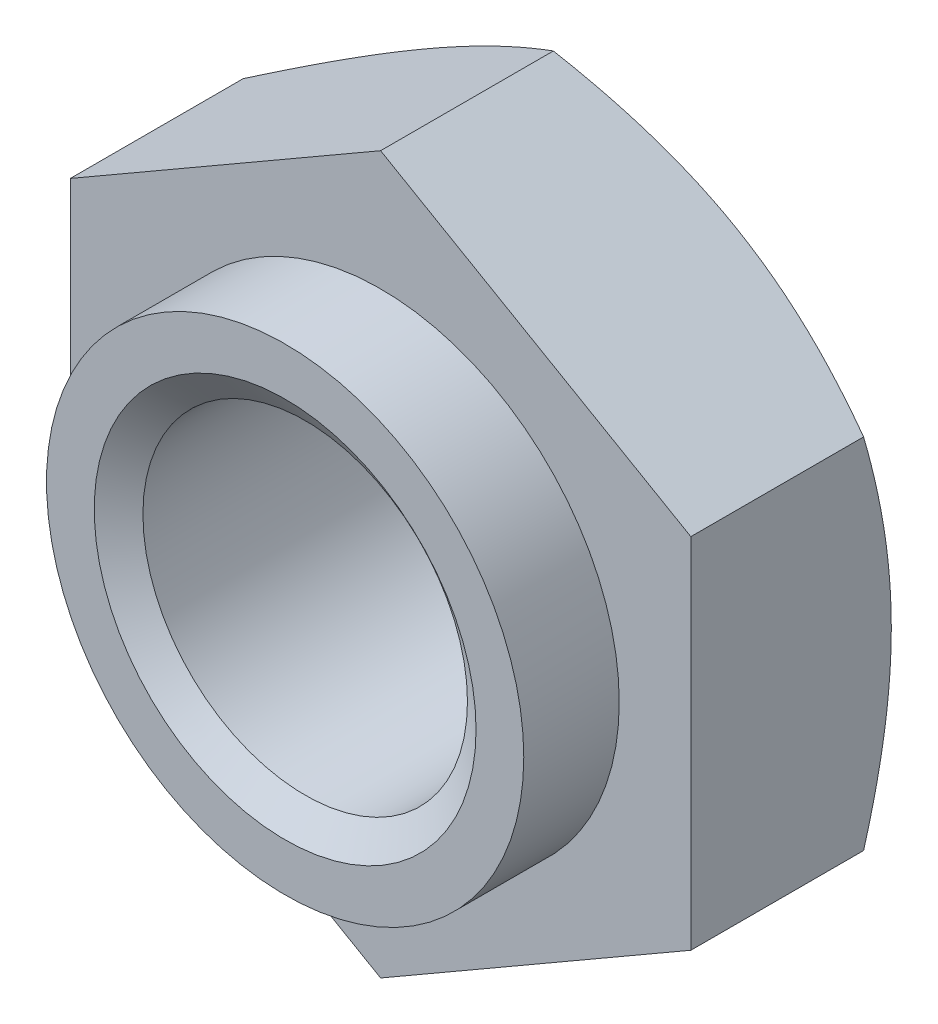
ISO-10303-21;
HEADER;
FILE_DESCRIPTION(('STEP AP214'),'2;1');
FILE_NAME('part.step','',(''),(''),'','','');
FILE_SCHEMA(('AUTOMOTIVE_DESIGN { 1 0 10303 214 1 1 1 1 }'));
ENDSEC;
DATA;
#1=APPLICATION_CONTEXT('core data for automotive mechanical design processes');
#2=APPLICATION_PROTOCOL_DEFINITION('international standard','automotive_design',2000,#1);
#3=PRODUCT_CONTEXT('',#1,'mechanical');
#4=PRODUCT('Part','Part','',(#3));
#5=PRODUCT_RELATED_PRODUCT_CATEGORY('part','',(#4));
#6=PRODUCT_DEFINITION_FORMATION('','',#4);
#7=PRODUCT_DEFINITION_CONTEXT('part definition',#1,'design');
#8=PRODUCT_DEFINITION('design','',#6,#7);
#9=PRODUCT_DEFINITION_SHAPE('','',#8);
#10=(LENGTH_UNIT() NAMED_UNIT(*) SI_UNIT(.MILLI.,.METRE.));
#11=(NAMED_UNIT(*) PLANE_ANGLE_UNIT() SI_UNIT($,.RADIAN.));
#12=(NAMED_UNIT(*) SI_UNIT($,.STERADIAN.) SOLID_ANGLE_UNIT());
#13=UNCERTAINTY_MEASURE_WITH_UNIT(LENGTH_MEASURE(1.E-05),#10,'distance_accuracy_value','');
#14=(GEOMETRIC_REPRESENTATION_CONTEXT(3) GLOBAL_UNCERTAINTY_ASSIGNED_CONTEXT((#13)) GLOBAL_UNIT_ASSIGNED_CONTEXT((#10,
#11,#12)) REPRESENTATION_CONTEXT('',''));
#15=CARTESIAN_POINT('',(0.,0.,0.));
#16=DIRECTION('',(0.,0.,1.));
#17=DIRECTION('',(1.,0.,0.));
#18=AXIS2_PLACEMENT_3D('',#15,#16,#17);
#19=CARTESIAN_POINT('',(0.,7.50555349946515,0.));
#20=DIRECTION('',(0.,0.,-1.));
#21=DIRECTION('',(-1.,0.,0.));
#22=AXIS2_PLACEMENT_3D('',#19,#20,#21);
#23=PLANE('',#22);
#24=CARTESIAN_POINT('',(0.,0.,0.));
#25=DIRECTION('',(0.,0.,1.));
#26=DIRECTION('',(1.,0.,0.));
#27=AXIS2_PLACEMENT_3D('',#24,#25,#26);
#28=CIRCLE('',#27,4.);
#29=CARTESIAN_POINT('',(4.,0.,0.));
#30=VERTEX_POINT('',#29);
#31=EDGE_CURVE('E152',#30,#30,#28,.T.);
#32=ORIENTED_EDGE('',*,*,#31,.F.);
#33=EDGE_LOOP('',(#32));
#34=FACE_BOUND('',#33,.T.);
#35=CARTESIAN_POINT('',(0.,0.,0.));
#36=DIRECTION('',(0.,0.,1.));
#37=DIRECTION('',(1.,0.,0.));
#38=AXIS2_PLACEMENT_3D('',#35,#36,#37);
#39=CIRCLE('',#38,5.);
#40=CARTESIAN_POINT('',(5.,0.,0.));
#41=VERTEX_POINT('',#40);
#42=EDGE_CURVE('E260',#41,#41,#39,.T.);
#43=ORIENTED_EDGE('',*,*,#42,.T.);
#44=EDGE_LOOP('',(#43));
#45=FACE_BOUND('',#44,.T.);
#46=ADVANCED_FACE('F41',(#34,#45),#23,.F.);
#47=CARTESIAN_POINT('',(0.,7.50555349946515,-6.2));
#48=DIRECTION('',(-0.500000000000002,0.866025403784437,0.));
#49=DIRECTION('',(-0.866025403784438,-0.500000000000002,0.));
#50=AXIS2_PLACEMENT_3D('',#47,#48,#49);
#51=PLANE('',#50);
#52=DIRECTION('',(0.,0.,1.));
#53=VECTOR('',#52,1.);
#54=CARTESIAN_POINT('',(-6.5,3.75277674973256,-6.2));
#55=LINE('',#54,#53);
#56=CARTESIAN_POINT('',(-6.5,3.7527767497326,-5.61944341639922));
#57=VERTEX_POINT('',#56);
#58=CARTESIAN_POINT('',(-6.5,3.75277674973256,-2.));
#59=VERTEX_POINT('',#58);
#60=EDGE_CURVE('E135',#57,#59,#55,.T.);
#61=ORIENTED_EDGE('',*,*,#60,.T.);
#62=DIRECTION('',(0.866025403784438,0.500000000000002,0.));
#63=VECTOR('',#62,1.);
#64=CARTESIAN_POINT('',(0.,7.50555349946515,-2.));
#65=LINE('',#64,#63);
#66=CARTESIAN_POINT('',(0.,7.50555349946515,-2.));
#67=VERTEX_POINT('',#66);
#68=EDGE_CURVE('E57',#59,#67,#65,.T.);
#69=ORIENTED_EDGE('',*,*,#68,.T.);
#70=DIRECTION('',(0.,0.,1.));
#71=VECTOR('',#70,1.);
#72=CARTESIAN_POINT('',(0.,7.50555349946515,-6.2));
#73=LINE('',#72,#71);
#74=CARTESIAN_POINT('',(0.,7.50555349946515,-5.61944341639922));
#75=VERTEX_POINT('',#74);
#76=EDGE_CURVE('E147',#75,#67,#73,.T.);
#77=ORIENTED_EDGE('',*,*,#76,.F.);
#78=CARTESIAN_POINT('',(-6.5002,3.75266127967872,-5.61937674819413));
#79=CARTESIAN_POINT('',(-6.35732254094112,3.83515161912749,-5.66699557692451));
#80=CARTESIAN_POINT('',(-6.21391236546509,3.91794952254311,-5.71245329939729));
#81=CARTESIAN_POINT('',(-5.9259273686828,4.08421773795794,-5.79845131797695));
#82=CARTESIAN_POINT('',(-5.78135207342874,4.16768832359104,-5.83898949277197));
#83=CARTESIAN_POINT('',(-5.34531134947997,4.41943655294051,-5.95242899887679));
#84=CARTESIAN_POINT('',(-5.05212471715368,4.58870793403689,-6.01695219287126));
#85=CARTESIAN_POINT('',(-4.61337625445563,4.84201947708215,-6.09261341645251));
#86=CARTESIAN_POINT('',(-4.46912536350531,4.92530276780316,-6.11416714354301));
#87=CARTESIAN_POINT('',(-4.17997178286191,5.09224566542477,-6.15030968539388));
#88=CARTESIAN_POINT('',(-4.03506915190111,5.17590523841627,-6.16489911554033));
#89=CARTESIAN_POINT('',(-3.74501222057168,5.34336968579963,-6.18674124749265));
#90=CARTESIAN_POINT('',(-3.59985839394579,5.427174286676,-6.19400227567789));
#91=CARTESIAN_POINT('',(-3.30942466302505,5.59485627940483,-6.20103969741777));
#92=CARTESIAN_POINT('',(-3.16414476276364,5.6787336689286,-6.2008163221878));
#93=CARTESIAN_POINT('',(-2.76612405757351,5.90853103021317,-6.18991654148483));
#94=CARTESIAN_POINT('',(-2.51351353897243,6.05437578112764,-6.17161818213058));
#95=CARTESIAN_POINT('',(-2.00997032176432,6.34509659313135,-6.11359365854232));
#96=CARTESIAN_POINT('',(-1.75903939406691,6.48997163178545,-6.07384766146175));
#97=CARTESIAN_POINT('',(-1.25448277935567,6.78127752911039,-5.97449409679784));
#98=CARTESIAN_POINT('',(-1.00092075856408,6.92767163007068,-5.91446557436197));
#99=CARTESIAN_POINT('',(-0.497578064240949,7.21827667013278,-5.77822500749012));
#100=CARTESIAN_POINT('',(-0.247790944447029,7.3624913309859,-5.7020449658364));
#101=CARTESIAN_POINT('',(0.000200000000007892,7.50566896951899,-5.61937674819412));
#102=B_SPLINE_CURVE_WITH_KNOTS('',3,(#78,#79,#80,#81,#82,#83,#84,#85,#86,#87,#88,#89,#90,#91,
#92,#93,#94,#95,#96,#97,#98,#99,#100,#101),.UNSPECIFIED.,.F.,.F.,(4,2,2,2,2,2,2,2,2,2,2,4),(0.,
0.515105052395587,1.03043143507525,2.06322554824262,2.56697389547996,3.07067772176454,
3.57380860368928,4.0769239424252,4.95279354705661,5.82947446853467,6.72559912449738,
7.61996451221048),.UNSPECIFIED.);
#103=CARTESIAN_POINT('',(-3.25000000000001,5.62916512459884,-6.2));
#104=VERTEX_POINT('',#103);
#105=EDGE_CURVE('E139',#104,#75,#102,.T.);
#106=ORIENTED_EDGE('',*,*,#105,.F.);
#107=EDGE_CURVE('E216',#57,#104,#102,.T.);
#108=ORIENTED_EDGE('',*,*,#107,.F.);
#109=EDGE_LOOP('',(#61,#69,#77,#106,#108));
#110=FACE_BOUND('',#109,.T.);
#111=ADVANCED_FACE('F43',(#110),#51,.T.);
#112=CARTESIAN_POINT('',(6.5,3.75277674973255,-6.2));
#113=DIRECTION('',(0.500000000000004,0.866025403784437,0.));
#114=DIRECTION('',(-0.866025403784437,0.500000000000004,0.));
#115=AXIS2_PLACEMENT_3D('',#112,#113,#114);
#116=PLANE('',#115);
#117=ORIENTED_EDGE('',*,*,#76,.T.);
#118=DIRECTION('',(0.866025403784437,-0.500000000000004,0.));
#119=VECTOR('',#118,1.);
#120=CARTESIAN_POINT('',(6.5,3.75277674973255,-2.));
#121=LINE('',#120,#119);
#122=CARTESIAN_POINT('',(6.5,3.75277674973259,-2.));
#123=VERTEX_POINT('',#122);
#124=EDGE_CURVE('E269',#67,#123,#121,.T.);
#125=ORIENTED_EDGE('',*,*,#124,.T.);
#126=DIRECTION('',(0.,0.,1.));
#127=VECTOR('',#126,1.);
#128=CARTESIAN_POINT('',(6.5,3.75277674973255,-6.2));
#129=LINE('',#128,#127);
#130=CARTESIAN_POINT('',(6.5,3.75277674973259,-5.61944341639922));
#131=VERTEX_POINT('',#130);
#132=EDGE_CURVE('E434',#131,#123,#129,.T.);
#133=ORIENTED_EDGE('',*,*,#132,.F.);
#134=CARTESIAN_POINT('',(-0.000199999999992055,7.50566896951899,-5.61937674819412));
#135=CARTESIAN_POINT('',(0.142677459058888,7.42317863007021,-5.6669955769245));
#136=CARTESIAN_POINT('',(0.286087634534921,7.34038072665459,-5.71245329939728));
#137=CARTESIAN_POINT('',(0.574072631317203,7.17411251123977,-5.79845131797694));
#138=CARTESIAN_POINT('',(0.718647926571273,7.09064192560666,-5.83898949277197));
#139=CARTESIAN_POINT('',(1.15468865052004,6.8388936962572,-5.95242899887678));
#140=CARTESIAN_POINT('',(1.44787528284633,6.66962231516081,-6.01695219287126));
#141=CARTESIAN_POINT('',(1.88662374554438,6.41631077211555,-6.0926134164525));
#142=CARTESIAN_POINT('',(2.0308746364947,6.33302748139455,-6.11416714354301));
#143=CARTESIAN_POINT('',(2.3200282171381,6.16608458377293,-6.15030968539388));
#144=CARTESIAN_POINT('',(2.4649308480989,6.08242501078143,-6.16489911554033));
#145=CARTESIAN_POINT('',(2.75498777942833,5.91496056339806,-6.18674124749265));
#146=CARTESIAN_POINT('',(2.90014160605422,5.8311559625217,-6.19400227567789));
#147=CARTESIAN_POINT('',(3.19057533697496,5.66347396979286,-6.20103969741777));
#148=CARTESIAN_POINT('',(3.33585523723637,5.5795965802691,-6.2008163221878));
#149=CARTESIAN_POINT('',(3.7338759424265,5.34979921898452,-6.18991654148483));
#150=CARTESIAN_POINT('',(3.98648646102758,5.20395446807006,-6.17161818213059));
#151=CARTESIAN_POINT('',(4.49002967823569,4.91323365606635,-6.11359365854233));
#152=CARTESIAN_POINT('',(4.74096060593309,4.76835861741225,-6.07384766146176));
#153=CARTESIAN_POINT('',(5.24551722064433,4.4770527200873,-5.97449409679785));
#154=CARTESIAN_POINT('',(5.49907924143592,4.33065861912701,-5.91446557436198));
#155=CARTESIAN_POINT('',(6.00242193575905,4.04005357906492,-5.77822500749013));
#156=CARTESIAN_POINT('',(6.25220905555296,3.8958389182118,-5.70204496583641));
#157=CARTESIAN_POINT('',(6.5002,3.75266127967871,-5.61937674819413));
#158=B_SPLINE_CURVE_WITH_KNOTS('',3,(#134,#135,#136,#137,#138,#139,#140,#141,#142,#143,#144,
#145,#146,#147,#148,#149,#150,#151,#152,#153,#154,#155,#156,#157),.UNSPECIFIED.,.F.,.F.,(4,2,2,
2,2,2,2,2,2,2,2,4),(0.,0.515105052395589,1.03043143507525,2.06322554824263,2.56697389547997,
3.07067772176455,3.57380860368929,4.07692394242521,4.95279354705661,5.82947446853467,
6.72559912449737,7.61996451221047),.UNSPECIFIED.);
#159=CARTESIAN_POINT('',(3.25000000000002,5.62916512459884,-6.2));
#160=VERTEX_POINT('',#159);
#161=EDGE_CURVE('E223',#160,#131,#158,.T.);
#162=ORIENTED_EDGE('',*,*,#161,.F.);
#163=EDGE_CURVE('E230',#75,#160,#158,.T.);
#164=ORIENTED_EDGE('',*,*,#163,.F.);
#165=EDGE_LOOP('',(#117,#125,#133,#162,#164));
#166=FACE_BOUND('',#165,.T.);
#167=ADVANCED_FACE('F232',(#166),#116,.T.);
#168=CARTESIAN_POINT('',(6.5,3.75277674973255,-6.2));
#169=DIRECTION('',(-1.,0.,0.));
#170=DIRECTION('',(0.,0.,1.));
#171=AXIS2_PLACEMENT_3D('',#168,#169,#170);
#172=PLANE('',#171);
#173=DIRECTION('',(0.,1.,0.));
#174=VECTOR('',#173,1.);
#175=CARTESIAN_POINT('',(6.5,3.75277674973255,-2.));
#176=LINE('',#175,#174);
#177=CARTESIAN_POINT('',(6.5,-3.7527767497326,-2.));
#178=VERTEX_POINT('',#177);
#179=EDGE_CURVE('E267',#178,#123,#176,.T.);
#180=ORIENTED_EDGE('',*,*,#179,.F.);
#181=DIRECTION('',(0.,0.,1.));
#182=VECTOR('',#181,1.);
#183=CARTESIAN_POINT('',(6.5,-3.7527767497326,-6.2));
#184=LINE('',#183,#182);
#185=CARTESIAN_POINT('',(6.5,-3.7527767497326,-5.61944341639922));
#186=VERTEX_POINT('',#185);
#187=EDGE_CURVE('E137',#186,#178,#184,.T.);
#188=ORIENTED_EDGE('',*,*,#187,.F.);
#189=CARTESIAN_POINT('',(6.5,-9.95291698368316,-3.08957641548399));
#190=CARTESIAN_POINT('',(6.5,-9.66753022820208,-3.22749106037634));
#191=CARTESIAN_POINT('',(6.5,-9.38146872221021,-3.36403471899929));
#192=CARTESIAN_POINT('',(6.5,-8.80763137697967,-3.63359663626834));
#193=CARTESIAN_POINT('',(6.5,-8.51985525134962,-3.76661428453063));
#194=CARTESIAN_POINT('',(6.5,-7.94066929123459,-4.02904149790464));
#195=CARTESIAN_POINT('',(6.5,-7.64924808662457,-4.15842605933752));
#196=CARTESIAN_POINT('',(6.5,-7.06401043497076,-4.41163779737715));
#197=CARTESIAN_POINT('',(6.5,-6.77019411372557,-4.53546526366485));
#198=CARTESIAN_POINT('',(6.5,-6.1760515021758,-4.77755519805377));
#199=CARTESIAN_POINT('',(6.5,-5.87568957429357,-4.89573068170171));
#200=CARTESIAN_POINT('',(6.5,-5.27142269448725,-5.12282610613645));
#201=CARTESIAN_POINT('',(6.5,-4.96751735264222,-5.231745017178));
#202=CARTESIAN_POINT('',(6.5,-4.35630541725464,-5.43740097792605));
#203=CARTESIAN_POINT('',(6.5,-4.04900762614676,-5.53416392620735));
#204=CARTESIAN_POINT('',(6.5,-3.43004022230999,-5.71236428796571));
#205=CARTESIAN_POINT('',(6.5,-3.11837202573311,-5.79380654792321));
#206=CARTESIAN_POINT('',(6.5,-2.49046594828967,-5.93741591980741));
#207=CARTESIAN_POINT('',(6.5,-2.17422687409776,-5.99957789947656));
#208=CARTESIAN_POINT('',(6.5,-1.53789167594822,-6.10042577746707));
#209=CARTESIAN_POINT('',(6.5,-1.21779554858072,-6.13911165503261));
#210=CARTESIAN_POINT('',(6.5,-0.737141963129293,-6.177053437943));
#211=CARTESIAN_POINT('',(6.5,-0.577336886979735,-6.18635478523692));
#212=CARTESIAN_POINT('',(6.5,-0.257468906786609,-6.19818591203539));
#213=CARTESIAN_POINT('',(6.5,-0.0974060061182723,-6.20071577947728));
#214=CARTESIAN_POINT('',(6.5,0.222635442153771,-6.19893598836916));
#215=CARTESIAN_POINT('',(6.5,0.382614000823759,-6.19462824931299));
#216=CARTESIAN_POINT('',(6.5,0.70225063496115,-6.17928241748036));
#217=CARTESIAN_POINT('',(6.5,0.861908694024532,-6.16824398859868));
#218=CARTESIAN_POINT('',(6.5,1.24887053403165,-6.13356313166607));
#219=CARTESIAN_POINT('',(6.5,1.47587694728922,-6.10654812140682));
#220=CARTESIAN_POINT('',(6.5,1.92815030612896,-6.04041011199497));
#221=CARTESIAN_POINT('',(6.5,2.15341675970354,-6.0012838079836));
#222=CARTESIAN_POINT('',(6.5,2.60202427843388,-5.9123108296342));
#223=CARTESIAN_POINT('',(6.5,2.82536331401074,-5.86245401911852));
#224=CARTESIAN_POINT('',(6.5,3.26974354822383,-5.75354123588692));
#225=CARTESIAN_POINT('',(6.5,3.49078496123692,-5.69448612977632));
#226=CARTESIAN_POINT('',(6.5,3.93601414582633,-5.56704588350692));
#227=CARTESIAN_POINT('',(6.5,4.16014622959188,-5.49846752707667));
#228=CARTESIAN_POINT('',(6.5,4.60604131565915,-5.35453487645891));
#229=CARTESIAN_POINT('',(6.5,4.82780583559524,-5.27918525590725));
#230=CARTESIAN_POINT('',(6.5,5.26807593346452,-5.12326649706656));
#231=CARTESIAN_POINT('',(6.5,5.48659282898108,-5.04272912495254));
#232=CARTESIAN_POINT('',(6.5,5.92193123194617,-4.87692729561374));
#233=CARTESIAN_POINT('',(6.5,6.13875201319723,-4.79166092786242));
#234=CARTESIAN_POINT('',(6.5,6.35478510853346,-4.70449786436965));
#235=B_SPLINE_CURVE_WITH_KNOTS('',3,(#189,#190,#191,#192,#193,#194,#195,#196,#197,#198,#199,
#200,#201,#202,#203,#204,#205,#206,#207,#208,#209,#210,#211,#212,#213,#214,#215,#216,#217,#218,
#219,#220,#221,#222,#223,#224,#225,#226,#227,#228,#229,#230,#231,#232,#233,#234),.UNSPECIFIED.,
.F.,.F.,(4,2,2,2,2,2,2,2,2,2,2,2,2,2,2,2,2,2,2,2,2,2,4),(0.,0.950904162864943,1.90197187472378,
2.85848216299727,3.81494253212838,4.78314526620908,5.75145556717362,6.71766655133577,
7.6835713726113,8.64973308985236,9.61589566130057,10.0960003863608,10.5760988765458,
11.0560626144433,11.5360503218788,12.2214931749034,12.9071232326805,13.5934038106301,
14.2796197706253,14.9826563668411,15.6852113891479,16.3838119598017,17.082696852468),.UNSPECIFIED.);
#236=CARTESIAN_POINT('',(6.5,0.,-6.2));
#237=VERTEX_POINT('',#236);
#238=EDGE_CURVE('E209',#186,#237,#235,.T.);
#239=ORIENTED_EDGE('',*,*,#238,.T.);
#240=EDGE_CURVE('E222',#237,#131,#235,.T.);
#241=ORIENTED_EDGE('',*,*,#240,.T.);
#242=ORIENTED_EDGE('',*,*,#132,.T.);
#243=EDGE_LOOP('',(#180,#188,#239,#241,#242));
#244=FACE_BOUND('',#243,.T.);
#245=ADVANCED_FACE('F236',(#244),#172,.F.);
#246=CARTESIAN_POINT('',(0.,-7.50555349946519,-6.2));
#247=DIRECTION('',(0.500000000000002,-0.866025403784438,0.));
#248=DIRECTION('',(0.866025403784438,0.500000000000002,0.));
#249=AXIS2_PLACEMENT_3D('',#246,#247,#248);
#250=PLANE('',#249);
#251=ORIENTED_EDGE('',*,*,#187,.T.);
#252=DIRECTION('',(-0.866025403784438,-0.500000000000002,0.));
#253=VECTOR('',#252,1.);
#254=CARTESIAN_POINT('',(0.,-7.50555349946519,-2.));
#255=LINE('',#254,#253);
#256=CARTESIAN_POINT('',(0.,-7.50555349946515,-2.));
#257=VERTEX_POINT('',#256);
#258=EDGE_CURVE('E127',#178,#257,#255,.T.);
#259=ORIENTED_EDGE('',*,*,#258,.T.);
#260=DIRECTION('',(0.,0.,1.));
#261=VECTOR('',#260,1.);
#262=CARTESIAN_POINT('',(0.,-7.50555349946519,-6.2));
#263=LINE('',#262,#261);
#264=CARTESIAN_POINT('',(0.,-7.50555349946515,-5.61944341639922));
#265=VERTEX_POINT('',#264);
#266=EDGE_CURVE('E126',#265,#257,#263,.T.);
#267=ORIENTED_EDGE('',*,*,#266,.F.);
#268=CARTESIAN_POINT('',(6.5002,-3.75266127967876,-5.61937674819412));
#269=CARTESIAN_POINT('',(6.35732254094112,-3.83515161912754,-5.6669955769245));
#270=CARTESIAN_POINT('',(6.21391236546509,-3.91794952254316,-5.71245329939728));
#271=CARTESIAN_POINT('',(5.92592736868281,-4.08421773795798,-5.79845131797694));
#272=CARTESIAN_POINT('',(5.78135207342874,-4.16768832359109,-5.83898949277196));
#273=CARTESIAN_POINT('',(5.34531134947996,-4.41943655294055,-5.95242899887678));
#274=CARTESIAN_POINT('',(5.05212471715368,-4.58870793403694,-6.01695219287125));
#275=CARTESIAN_POINT('',(4.61337625445562,-4.84201947708219,-6.09261341645249));
#276=CARTESIAN_POINT('',(4.4691253635053,-4.9253027678032,-6.114167143543));
#277=CARTESIAN_POINT('',(4.17997178286191,-5.09224566542481,-6.15030968539386));
#278=CARTESIAN_POINT('',(4.0350691519011,-5.17590523841632,-6.16489911554032));
#279=CARTESIAN_POINT('',(3.74501222057167,-5.34336968579968,-6.18674124749263));
#280=CARTESIAN_POINT('',(3.59985839394578,-5.42717428667604,-6.19400227567787));
#281=CARTESIAN_POINT('',(3.30942466302504,-5.59485627940488,-6.20103969741775));
#282=CARTESIAN_POINT('',(3.16414476276363,-5.67873366892865,-6.20081632218777));
#283=CARTESIAN_POINT('',(2.7661240575735,-5.90853103021322,-6.18991654148481));
#284=CARTESIAN_POINT('',(2.51351353897242,-6.05437578112768,-6.17161818213056));
#285=CARTESIAN_POINT('',(2.00997032176431,-6.3450965931314,-6.1135936585423));
#286=CARTESIAN_POINT('',(1.75903939406691,-6.48997163178549,-6.07384766146173));
#287=CARTESIAN_POINT('',(1.25448277935567,-6.78127752911043,-5.97449409679782));
#288=CARTESIAN_POINT('',(1.00092075856408,-6.92767163007073,-5.91446557436194));
#289=CARTESIAN_POINT('',(0.497578064240953,-7.21827667013282,-5.7782250074901));
#290=CARTESIAN_POINT('',(0.247790944447035,-7.36249133098594,-5.70204496583637));
#291=CARTESIAN_POINT('',(-0.000200000000001396,-7.50566896951902,-5.6193767481941));
#292=B_SPLINE_CURVE_WITH_KNOTS('',3,(#268,#269,#270,#271,#272,#273,#274,#275,#276,#277,#278,
#279,#280,#281,#282,#283,#284,#285,#286,#287,#288,#289,#290,#291),.UNSPECIFIED.,.F.,.F.,(4,2,2,
2,2,2,2,2,2,2,2,4),(0.,0.51510505239559,1.03043143507525,2.06322554824263,2.56697389547998,
3.07067772176455,3.57380860368929,4.07692394242522,4.95279354705662,5.82947446853468,
6.72559912449738,7.61996451221047),.UNSPECIFIED.);
#293=CARTESIAN_POINT('',(3.25000000000001,-5.62916512459885,-6.2));
#294=VERTEX_POINT('',#293);
#295=EDGE_CURVE('E202',#294,#265,#292,.T.);
#296=ORIENTED_EDGE('',*,*,#295,.F.);
#297=EDGE_CURVE('E426',#186,#294,#292,.T.);
#298=ORIENTED_EDGE('',*,*,#297,.F.);
#299=EDGE_LOOP('',(#251,#259,#267,#296,#298));
#300=FACE_BOUND('',#299,.T.);
#301=ADVANCED_FACE('F241',(#300),#250,.T.);
#302=CARTESIAN_POINT('',(-6.5,-3.75277674973259,-6.2));
#303=DIRECTION('',(-0.500000000000003,-0.866025403784437,0.));
#304=DIRECTION('',(0.866025403784437,-0.500000000000003,0.));
#305=AXIS2_PLACEMENT_3D('',#302,#303,#304);
#306=PLANE('',#305);
#307=ORIENTED_EDGE('',*,*,#266,.T.);
#308=DIRECTION('',(-0.866025403784437,0.500000000000003,0.));
#309=VECTOR('',#308,1.);
#310=CARTESIAN_POINT('',(-6.5,-3.75277674973259,-2.));
#311=LINE('',#310,#309);
#312=CARTESIAN_POINT('',(-6.5,-3.7527767497326,-2.));
#313=VERTEX_POINT('',#312);
#314=EDGE_CURVE('E113',#257,#313,#311,.T.);
#315=ORIENTED_EDGE('',*,*,#314,.T.);
#316=DIRECTION('',(0.,0.,1.));
#317=VECTOR('',#316,1.);
#318=CARTESIAN_POINT('',(-6.5,-3.75277674973259,-6.2));
#319=LINE('',#318,#317);
#320=CARTESIAN_POINT('',(-6.5,-3.7527767497326,-5.61944341639922));
#321=VERTEX_POINT('',#320);
#322=EDGE_CURVE('E124',#321,#313,#319,.T.);
#323=ORIENTED_EDGE('',*,*,#322,.F.);
#324=CARTESIAN_POINT('',(0.00019999999999873,-7.50566896951902,-5.6193767481941));
#325=CARTESIAN_POINT('',(-0.142677459058882,-7.42317863007025,-5.66699557692448));
#326=CARTESIAN_POINT('',(-0.286087634534915,-7.34038072665463,-5.71245329939726));
#327=CARTESIAN_POINT('',(-0.574072631317199,-7.1741125112398,-5.79845131797692));
#328=CARTESIAN_POINT('',(-0.718647926571269,-7.0906419256067,-5.83898949277195));
#329=CARTESIAN_POINT('',(-1.15468865052004,-6.83889369625723,-5.95242899887677));
#330=CARTESIAN_POINT('',(-1.44787528284633,-6.66962231516085,-6.01695219287124));
#331=CARTESIAN_POINT('',(-1.88662374554439,-6.41631077211559,-6.09261341645249));
#332=CARTESIAN_POINT('',(-2.0308746364947,-6.33302748139458,-6.11416714354299));
#333=CARTESIAN_POINT('',(-2.3200282171381,-6.16608458377296,-6.15030968539386));
#334=CARTESIAN_POINT('',(-2.4649308480989,-6.08242501078146,-6.16489911554031));
#335=CARTESIAN_POINT('',(-2.75498777942834,-5.91496056339809,-6.18674124749263));
#336=CARTESIAN_POINT('',(-2.90014160605423,-5.83115596252173,-6.19400227567787));
#337=CARTESIAN_POINT('',(-3.19057533697497,-5.66347396979289,-6.20103969741775));
#338=CARTESIAN_POINT('',(-3.33585523723638,-5.57959658026913,-6.20081632218778));
#339=CARTESIAN_POINT('',(-3.73387594242651,-5.34979921898455,-6.18991654148482));
#340=CARTESIAN_POINT('',(-3.98648646102759,-5.20395446807009,-6.17161818213057));
#341=CARTESIAN_POINT('',(-4.49002967823569,-4.91323365606638,-6.11359365854231));
#342=CARTESIAN_POINT('',(-4.74096060593309,-4.76835861741228,-6.07384766146174));
#343=CARTESIAN_POINT('',(-5.24551722064433,-4.47705272008734,-5.97449409679784));
#344=CARTESIAN_POINT('',(-5.49907924143592,-4.33065861912705,-5.91446557436196));
#345=CARTESIAN_POINT('',(-6.00242193575905,-4.04005357906496,-5.77822500749012));
#346=CARTESIAN_POINT('',(-6.25220905555296,-3.89583891821184,-5.7020449658364));
#347=CARTESIAN_POINT('',(-6.5002,-3.75266127967875,-5.61937674819412));
#348=B_SPLINE_CURVE_WITH_KNOTS('',3,(#324,#325,#326,#327,#328,#329,#330,#331,#332,#333,#334,
#335,#336,#337,#338,#339,#340,#341,#342,#343,#344,#345,#346,#347),.UNSPECIFIED.,.F.,.F.,(4,2,2,
2,2,2,2,2,2,2,2,4),(0.,0.515105052395592,1.03043143507525,2.06322554824264,2.56697389547998,
3.07067772176456,3.57380860368931,4.07692394242523,4.95279354705663,5.82947446853469,
6.72559912449738,7.61996451221047),.UNSPECIFIED.);
#349=CARTESIAN_POINT('',(-3.25000000000002,-5.62916512459884,-6.2));
#350=VERTEX_POINT('',#349);
#351=EDGE_CURVE('E176',#350,#321,#348,.T.);
#352=ORIENTED_EDGE('',*,*,#351,.F.);
#353=EDGE_CURVE('E64',#265,#350,#348,.T.);
#354=ORIENTED_EDGE('',*,*,#353,.F.);
#355=EDGE_LOOP('',(#307,#315,#323,#352,#354));
#356=FACE_BOUND('',#355,.T.);
#357=ADVANCED_FACE('F122',(#356),#306,.T.);
#358=CARTESIAN_POINT('',(-6.5,3.75277674973256,-6.2));
#359=DIRECTION('',(-1.,0.,0.));
#360=DIRECTION('',(0.,0.,1.));
#361=AXIS2_PLACEMENT_3D('',#358,#359,#360);
#362=PLANE('',#361);
#363=ORIENTED_EDGE('',*,*,#322,.T.);
#364=DIRECTION('',(0.,1.,0.));
#365=VECTOR('',#364,1.);
#366=CARTESIAN_POINT('',(-6.5,3.75277674973256,-2.));
#367=LINE('',#366,#365);
#368=EDGE_CURVE('E11',#313,#59,#367,.T.);
#369=ORIENTED_EDGE('',*,*,#368,.T.);
#370=ORIENTED_EDGE('',*,*,#60,.F.);
#371=CARTESIAN_POINT('',(-6.5,-9.95291698368315,-3.089576415484));
#372=CARTESIAN_POINT('',(-6.5,-9.66753022820207,-3.22749106037635));
#373=CARTESIAN_POINT('',(-6.5,-9.38146872221019,-3.3640347189993));
#374=CARTESIAN_POINT('',(-6.5,-8.80763137697966,-3.63359663626834));
#375=CARTESIAN_POINT('',(-6.5,-8.51985525134961,-3.76661428453064));
#376=CARTESIAN_POINT('',(-6.5,-7.94066929123457,-4.02904149790465));
#377=CARTESIAN_POINT('',(-6.5,-7.64924808662455,-4.15842605933753));
#378=CARTESIAN_POINT('',(-6.5,-7.06401043497074,-4.41163779737716));
#379=CARTESIAN_POINT('',(-6.5,-6.77019411372556,-4.53546526366486));
#380=CARTESIAN_POINT('',(-6.5,-6.17605150217579,-4.77755519805378));
#381=CARTESIAN_POINT('',(-6.5,-5.87568957429355,-4.89573068170172));
#382=CARTESIAN_POINT('',(-6.5,-5.27142269448724,-5.12282610613646));
#383=CARTESIAN_POINT('',(-6.5,-4.96751735264221,-5.23174501717801));
#384=CARTESIAN_POINT('',(-6.5,-4.35630541725462,-5.43740097792606));
#385=CARTESIAN_POINT('',(-6.5,-4.04900762614674,-5.53416392620735));
#386=CARTESIAN_POINT('',(-6.5,-3.43004022230998,-5.71236428796571));
#387=CARTESIAN_POINT('',(-6.5,-3.1183720257331,-5.79380654792322));
#388=CARTESIAN_POINT('',(-6.5,-2.49046594828966,-5.93741591980742));
#389=CARTESIAN_POINT('',(-6.5,-2.17422687409776,-5.99957789947656));
#390=CARTESIAN_POINT('',(-6.5,-1.53789167594821,-6.10042577746707));
#391=CARTESIAN_POINT('',(-6.5,-1.21779554858071,-6.13911165503261));
#392=CARTESIAN_POINT('',(-6.5,-0.737141963129287,-6.177053437943));
#393=CARTESIAN_POINT('',(-6.5,-0.577336886979729,-6.18635478523692));
#394=CARTESIAN_POINT('',(-6.5,-0.257468906786603,-6.19818591203539));
#395=CARTESIAN_POINT('',(-6.5,-0.0974060061182664,-6.20071577947728));
#396=CARTESIAN_POINT('',(-6.5,0.222635442153776,-6.19893598836916));
#397=CARTESIAN_POINT('',(-6.5,0.382614000823763,-6.194628249313));
#398=CARTESIAN_POINT('',(-6.5,0.702250634961155,-6.17928241748036));
#399=CARTESIAN_POINT('',(-6.5,0.861908694024537,-6.16824398859868));
#400=CARTESIAN_POINT('',(-6.5,1.24887053403166,-6.13356313166607));
#401=CARTESIAN_POINT('',(-6.5,1.47587694728922,-6.10654812140682));
#402=CARTESIAN_POINT('',(-6.5,1.92815030612897,-6.04041011199497));
#403=CARTESIAN_POINT('',(-6.5,2.15341675970354,-6.0012838079836));
#404=CARTESIAN_POINT('',(-6.5,2.60202427843389,-5.9123108296342));
#405=CARTESIAN_POINT('',(-6.5,2.82536331401075,-5.86245401911852));
#406=CARTESIAN_POINT('',(-6.5,3.26974354822383,-5.75354123588692));
#407=CARTESIAN_POINT('',(-6.5,3.49078496123693,-5.69448612977631));
#408=CARTESIAN_POINT('',(-6.5,3.93601414582634,-5.56704588350692));
#409=CARTESIAN_POINT('',(-6.5,4.16014622959189,-5.49846752707667));
#410=CARTESIAN_POINT('',(-6.5,4.60604131565916,-5.35453487645891));
#411=CARTESIAN_POINT('',(-6.5,4.82780583559525,-5.27918525590725));
#412=CARTESIAN_POINT('',(-6.5,5.26807593346453,-5.12326649706656));
#413=CARTESIAN_POINT('',(-6.5,5.48659282898109,-5.04272912495254));
#414=CARTESIAN_POINT('',(-6.5,5.92193123194618,-4.87692729561373));
#415=CARTESIAN_POINT('',(-6.5,6.13875201319724,-4.79166092786242));
#416=CARTESIAN_POINT('',(-6.5,6.35478510853347,-4.70449786436964));
#417=B_SPLINE_CURVE_WITH_KNOTS('',3,(#371,#372,#373,#374,#375,#376,#377,#378,#379,#380,#381,
#382,#383,#384,#385,#386,#387,#388,#389,#390,#391,#392,#393,#394,#395,#396,#397,#398,#399,#400,
#401,#402,#403,#404,#405,#406,#407,#408,#409,#410,#411,#412,#413,#414,#415,#416),.UNSPECIFIED.,
.F.,.F.,(4,2,2,2,2,2,2,2,2,2,2,2,2,2,2,2,2,2,2,2,2,2,4),(0.,0.950904162864942,1.90197187472378,
2.85848216299728,3.81494253212838,4.78314526620908,5.75145556717362,6.71766655133577,
7.6835713726113,8.64973308985235,9.61589566130056,10.0960003863608,10.5760988765458,
11.0560626144432,11.5360503218788,12.2214931749033,12.9071232326805,13.5934038106301,
14.2796197706252,14.9826563668411,15.6852113891479,16.3838119598017,17.082696852468),.UNSPECIFIED.);
#418=CARTESIAN_POINT('',(-6.5,0.,-6.2));
#419=VERTEX_POINT('',#418);
#420=EDGE_CURVE('E169',#419,#57,#417,.T.);
#421=ORIENTED_EDGE('',*,*,#420,.F.);
#422=EDGE_CURVE('E134',#321,#419,#417,.T.);
#423=ORIENTED_EDGE('',*,*,#422,.F.);
#424=EDGE_LOOP('',(#363,#369,#370,#421,#423));
#425=FACE_BOUND('',#424,.T.);
#426=ADVANCED_FACE('F131',(#425),#362,.T.);
#427=CARTESIAN_POINT('',(0.,0.,-6.2));
#428=DIRECTION('',(0.,0.,1.));
#429=DIRECTION('',(1.,0.,0.));
#430=AXIS2_PLACEMENT_3D('',#427,#428,#429);
#431=CYLINDRICAL_SURFACE('',#430,3.4);
#432=CARTESIAN_POINT('',(0.,0.,-0.420124522925827));
#433=DIRECTION('',(0.,0.,1.));
#434=DIRECTION('',(1.,0.,0.));
#435=AXIS2_PLACEMENT_3D('',#432,#433,#434);
#436=CIRCLE('',#435,3.4);
#437=CARTESIAN_POINT('',(3.4,0.,-0.420124522925827));
#438=VERTEX_POINT('',#437);
#439=EDGE_CURVE('E148',#438,#438,#436,.F.);
#440=CARTESIAN_POINT('',(0.,0.,-5.75447547707417));
#441=DIRECTION('',(0.,0.,-1.));
#442=DIRECTION('',(-1.,0.,0.));
#443=AXIS2_PLACEMENT_3D('',#440,#441,#442);
#444=CIRCLE('',#443,3.4);
#445=CARTESIAN_POINT('',(3.4,0.,-5.75447547707417));
#446=VERTEX_POINT('',#445);
#447=EDGE_CURVE('E155',#446,#446,#444,.F.);
#448=CARTESIAN_POINT('',(3.4,0.,-0.420124522925827));
#449=CARTESIAN_POINT('',(3.4,0.,-0.475690678698206));
#450=CARTESIAN_POINT('',(3.4,0.,-0.531256834470584));
#451=CARTESIAN_POINT('',(3.4,0.,-0.642389146015341));
#452=CARTESIAN_POINT('',(3.4,0.,-0.69795530178772));
#453=CARTESIAN_POINT('',(3.4,0.,-0.809087613332477));
#454=CARTESIAN_POINT('',(3.4,0.,-0.864653769104856));
#455=CARTESIAN_POINT('',(3.4,0.,-0.975786080649613));
#456=CARTESIAN_POINT('',(3.4,0.,-1.03135223642199));
#457=CARTESIAN_POINT('',(3.4,0.,-1.14248454796675));
#458=CARTESIAN_POINT('',(3.4,0.,-1.19805070373913));
#459=CARTESIAN_POINT('',(3.4,0.,-1.30918301528388));
#460=CARTESIAN_POINT('',(3.4,0.,-1.36474917105626));
#461=CARTESIAN_POINT('',(3.4,0.,-1.47588148260102));
#462=CARTESIAN_POINT('',(3.4,0.,-1.5314476383734));
#463=CARTESIAN_POINT('',(3.4,0.,-1.64257994991816));
#464=CARTESIAN_POINT('',(3.4,0.,-1.69814610569053));
#465=CARTESIAN_POINT('',(3.4,0.,-1.80927841723529));
#466=CARTESIAN_POINT('',(3.4,0.,-1.86484457300767));
#467=CARTESIAN_POINT('',(3.4,0.,-1.97597688455243));
#468=CARTESIAN_POINT('',(3.4,0.,-2.03154304032481));
#469=CARTESIAN_POINT('',(3.4,0.,-2.14267535186956));
#470=CARTESIAN_POINT('',(3.4,0.,-2.19824150764194));
#471=CARTESIAN_POINT('',(3.4,0.,-2.3093738191867));
#472=CARTESIAN_POINT('',(3.4,0.,-2.36493997495908));
#473=CARTESIAN_POINT('',(3.4,0.,-2.47607228650384));
#474=CARTESIAN_POINT('',(3.4,0.,-2.53163844227621));
#475=CARTESIAN_POINT('',(3.4,0.,-2.64277075382097));
#476=CARTESIAN_POINT('',(3.4,0.,-2.69833690959335));
#477=CARTESIAN_POINT('',(3.4,0.,-2.80946922113811));
#478=CARTESIAN_POINT('',(3.4,0.,-2.86503537691049));
#479=CARTESIAN_POINT('',(3.4,0.,-2.97616768845524));
#480=CARTESIAN_POINT('',(3.4,0.,-3.03173384422762));
#481=CARTESIAN_POINT('',(3.4,0.,-3.14286615577238));
#482=CARTESIAN_POINT('',(3.4,0.,-3.19843231154476));
#483=CARTESIAN_POINT('',(3.4,0.,-3.30956462308951));
#484=CARTESIAN_POINT('',(3.4,0.,-3.36513077886189));
#485=CARTESIAN_POINT('',(3.4,0.,-3.47626309040665));
#486=CARTESIAN_POINT('',(3.4,0.,-3.53182924617903));
#487=CARTESIAN_POINT('',(3.4,0.,-3.64296155772379));
#488=CARTESIAN_POINT('',(3.4,0.,-3.69852771349616));
#489=CARTESIAN_POINT('',(3.4,0.,-3.80966002504092));
#490=CARTESIAN_POINT('',(3.4,0.,-3.8652261808133));
#491=CARTESIAN_POINT('',(3.4,0.,-3.97635849235806));
#492=CARTESIAN_POINT('',(3.4,0.,-4.03192464813044));
#493=CARTESIAN_POINT('',(3.4,0.,-4.14305695967519));
#494=CARTESIAN_POINT('',(3.4,0.,-4.19862311544757));
#495=CARTESIAN_POINT('',(3.4,0.,-4.30975542699233));
#496=CARTESIAN_POINT('',(3.4,0.,-4.36532158276471));
#497=CARTESIAN_POINT('',(3.4,0.,-4.47645389430946));
#498=CARTESIAN_POINT('',(3.4,0.,-4.53202005008184));
#499=CARTESIAN_POINT('',(3.4,0.,-4.6431523616266));
#500=CARTESIAN_POINT('',(3.4,0.,-4.69871851739898));
#501=CARTESIAN_POINT('',(3.4,0.,-4.80985082894374));
#502=CARTESIAN_POINT('',(3.4,0.,-4.86541698471612));
#503=CARTESIAN_POINT('',(3.4,0.,-4.97654929626087));
#504=CARTESIAN_POINT('',(3.4,0.,-5.03211545203325));
#505=CARTESIAN_POINT('',(3.4,0.,-5.14324776357801));
#506=CARTESIAN_POINT('',(3.4,0.,-5.19881391935039));
#507=CARTESIAN_POINT('',(3.4,0.,-5.30994623089514));
#508=CARTESIAN_POINT('',(3.4,0.,-5.36551238666752));
#509=CARTESIAN_POINT('',(3.4,0.,-5.47664469821228));
#510=CARTESIAN_POINT('',(3.4,0.,-5.53221085398466));
#511=CARTESIAN_POINT('',(3.4,0.,-5.64334316552941));
#512=CARTESIAN_POINT('',(3.4,0.,-5.69890932130179));
#513=CARTESIAN_POINT('',(3.4,0.,-5.75447547707417));
#514=B_SPLINE_CURVE_WITH_KNOTS('',3,(#448,#449,#450,#451,#452,#453,#454,#455,#456,#457,#458,
#459,#460,#461,#462,#463,#464,#465,#466,#467,#468,#469,#470,#471,#472,#473,#474,#475,#476,#477,
#478,#479,#480,#481,#482,#483,#484,#485,#486,#487,#488,#489,#490,#491,#492,#493,#494,#495,#496,
#497,#498,#499,#500,#501,#502,#503,#504,#505,#506,#507,#508,#509,#510,#511,#512,#513),
.UNSPECIFIED.,.F.,.F.,(4,2,2,2,2,2,2,2,2,2,2,2,2,2,2,2,2,2,2,2,2,2,2,2,2,2,2,2,2,2,2,2,4),(0.,
0.166698467317136,0.333396934634272,0.500095401951408,0.666793869268543,0.833492336585679,
1.00019080390282,1.16688927121995,1.33358773853709,1.50028620585422,1.66698467317136,
1.83368314048849,2.00038160780563,2.16708007512277,2.3337785424399,2.50047700975704,
2.66717547707417,2.83387394439131,3.00057241170844,3.16727087902558,3.33396934634272,
3.50066781365985,3.66736628097699,3.83406474829412,4.00076321561126,4.1674616829284,
4.33416015024553,4.50085861756267,4.6675570848798,4.83425555219694,5.00095401951407,
5.16765248683121,5.33435095414835),.UNSPECIFIED.);
#515=EDGE_CURVE('BSEAM194',#438,#446,#514,.T.);
#516=ORIENTED_EDGE('',*,*,#439,.F.);
#517=ORIENTED_EDGE('',*,*,#447,.F.);
#518=ORIENTED_EDGE('',*,*,#515,.T.);
#519=ORIENTED_EDGE('',*,*,#515,.F.);
#520=EDGE_LOOP('',(#516,#518,#517,#519));
#521=FACE_BOUND('',#520,.T.);
#522=ADVANCED_FACE('F194',(#521),#431,.F.);
#523=CARTESIAN_POINT('',(0.,7.50555349946515,-6.2));
#524=DIRECTION('',(0.,0.,-1.));
#525=DIRECTION('',(-1.,0.,0.));
#526=AXIS2_PLACEMENT_3D('',#523,#524,#525);
#527=PLANE('',#526);
#528=CARTESIAN_POINT('',(0.,0.,-6.2));
#529=DIRECTION('',(0.,0.,-1.));
#530=DIRECTION('',(-1.,0.,0.));
#531=AXIS2_PLACEMENT_3D('',#528,#529,#530);
#532=CIRCLE('',#531,6.5);
#533=EDGE_CURVE('E50',#419,#350,#532,.F.);
#534=ORIENTED_EDGE('',*,*,#533,.F.);
#535=EDGE_CURVE('E143',#104,#419,#532,.F.);
#536=ORIENTED_EDGE('',*,*,#535,.F.);
#537=EDGE_CURVE('E146',#160,#104,#532,.F.);
#538=ORIENTED_EDGE('',*,*,#537,.F.);
#539=CARTESIAN_POINT('',(0.,0.,-6.2));
#540=DIRECTION('',(0.,0.,1.));
#541=DIRECTION('',(1.,0.,0.));
#542=AXIS2_PLACEMENT_3D('',#539,#540,#541);
#543=CIRCLE('',#542,6.5);
#544=EDGE_CURVE('E151',#237,#160,#543,.T.);
#545=ORIENTED_EDGE('',*,*,#544,.F.);
#546=EDGE_CURVE('E444',#294,#237,#532,.F.);
#547=ORIENTED_EDGE('',*,*,#546,.F.);
#548=EDGE_CURVE('E423',#350,#294,#532,.F.);
#549=ORIENTED_EDGE('',*,*,#548,.F.);
#550=EDGE_LOOP('',(#534,#536,#538,#545,#547,#549));
#551=FACE_BOUND('',#550,.T.);
#552=CARTESIAN_POINT('',(0.,0.,-6.2));
#553=DIRECTION('',(0.,0.,-1.));
#554=DIRECTION('',(-1.,0.,0.));
#555=AXIS2_PLACEMENT_3D('',#552,#553,#554);
#556=CIRCLE('',#555,4.);
#557=CARTESIAN_POINT('',(-4.,0.,-6.2));
#558=VERTEX_POINT('',#557);
#559=EDGE_CURVE('E153',#558,#558,#556,.F.);
#560=ORIENTED_EDGE('',*,*,#559,.T.);
#561=EDGE_LOOP('',(#560));
#562=FACE_BOUND('',#561,.T.);
#563=ADVANCED_FACE('F238',(#551,#562),#527,.T.);
#564=CARTESIAN_POINT('',(0.,0.,-6.2));
#565=DIRECTION('',(0.,0.,1.));
#566=DIRECTION('',(1.,0.,0.));
#567=AXIS2_PLACEMENT_3D('',#564,#565,#566);
#568=CONICAL_SURFACE('',#567,6.5,1.0471975511966);
#569=ORIENTED_EDGE('',*,*,#107,.T.);
#570=ORIENTED_EDGE('',*,*,#535,.T.);
#571=ORIENTED_EDGE('',*,*,#420,.T.);
#572=EDGE_LOOP('',(#569,#570,#571));
#573=FACE_BOUND('',#572,.T.);
#574=ADVANCED_FACE('F358',(#573),#568,.T.);
#575=ORIENTED_EDGE('',*,*,#105,.T.);
#576=ORIENTED_EDGE('',*,*,#163,.T.);
#577=ORIENTED_EDGE('',*,*,#537,.T.);
#578=EDGE_LOOP('',(#575,#576,#577));
#579=FACE_BOUND('',#578,.T.);
#580=ADVANCED_FACE('F192',(#579),#568,.T.);
#581=ORIENTED_EDGE('',*,*,#161,.T.);
#582=ORIENTED_EDGE('',*,*,#240,.F.);
#583=ORIENTED_EDGE('',*,*,#544,.T.);
#584=EDGE_LOOP('',(#581,#582,#583));
#585=FACE_BOUND('',#584,.T.);
#586=ADVANCED_FACE('F372',(#585),#568,.T.);
#587=ORIENTED_EDGE('',*,*,#297,.T.);
#588=ORIENTED_EDGE('',*,*,#546,.T.);
#589=ORIENTED_EDGE('',*,*,#238,.F.);
#590=EDGE_LOOP('',(#587,#588,#589));
#591=FACE_BOUND('',#590,.T.);
#592=ADVANCED_FACE('F366',(#591),#568,.T.);
#593=ORIENTED_EDGE('',*,*,#295,.T.);
#594=ORIENTED_EDGE('',*,*,#353,.T.);
#595=ORIENTED_EDGE('',*,*,#548,.T.);
#596=EDGE_LOOP('',(#593,#594,#595));
#597=FACE_BOUND('',#596,.T.);
#598=ADVANCED_FACE('F190',(#597),#568,.T.);
#599=ORIENTED_EDGE('',*,*,#351,.T.);
#600=ORIENTED_EDGE('',*,*,#422,.T.);
#601=ORIENTED_EDGE('',*,*,#533,.T.);
#602=EDGE_LOOP('',(#599,#600,#601));
#603=FACE_BOUND('',#602,.T.);
#604=ADVANCED_FACE('F184',(#603),#568,.T.);
#605=CARTESIAN_POINT('',(0.,0.,-0.462136975218408));
#606=DIRECTION('',(0.,0.,1.));
#607=DIRECTION('',(1.,0.,0.));
#608=AXIS2_PLACEMENT_3D('',#605,#606,#607);
#609=CONICAL_SURFACE('',#608,3.34,0.959931088596876);
#610=ORIENTED_EDGE('',*,*,#31,.T.);
#611=EDGE_LOOP('',(#610));
#612=FACE_BOUND('',#611,.T.);
#613=ORIENTED_EDGE('',*,*,#439,.T.);
#614=EDGE_LOOP('',(#613));
#615=FACE_BOUND('',#614,.T.);
#616=ADVANCED_FACE('F189',(#612,#615),#609,.F.);
#617=CARTESIAN_POINT('',(0.,0.,-6.1746));
#618=DIRECTION('',(0.,0.,-1.));
#619=DIRECTION('',(-1.,0.,0.));
#620=AXIS2_PLACEMENT_3D('',#617,#618,#619);
#621=CONICAL_SURFACE('',#620,4.,0.959931088596881);
#622=CARTESIAN_POINT('',(0.,0.,-6.1746));
#623=DIRECTION('',(0.,0.,1.));
#624=DIRECTION('',(1.,0.,0.));
#625=AXIS2_PLACEMENT_3D('',#622,#623,#624);
#626=CIRCLE('',#625,4.);
#627=CARTESIAN_POINT('',(4.,0.,-6.1746));
#628=VERTEX_POINT('',#627);
#629=EDGE_CURVE('E156',#628,#628,#626,.T.);
#630=ORIENTED_EDGE('',*,*,#629,.F.);
#631=EDGE_LOOP('',(#630));
#632=FACE_BOUND('',#631,.T.);
#633=ORIENTED_EDGE('',*,*,#447,.T.);
#634=EDGE_LOOP('',(#633));
#635=FACE_BOUND('',#634,.T.);
#636=ADVANCED_FACE('F278',(#632,#635),#621,.F.);
#637=CARTESIAN_POINT('',(0.,0.,-25.0375057290932));
#638=DIRECTION('',(0.,0.,1.));
#639=DIRECTION('',(1.,0.,0.));
#640=AXIS2_PLACEMENT_3D('',#637,#638,#639);
#641=CYLINDRICAL_SURFACE('',#640,4.);
#642=ORIENTED_EDGE('',*,*,#559,.F.);
#643=EDGE_LOOP('',(#642));
#644=FACE_BOUND('',#643,.T.);
#645=ORIENTED_EDGE('',*,*,#629,.T.);
#646=EDGE_LOOP('',(#645));
#647=FACE_BOUND('',#646,.T.);
#648=ADVANCED_FACE('F276',(#644,#647),#641,.F.);
#649=CARTESIAN_POINT('',(0.,0.,-2.));
#650=DIRECTION('',(0.,0.,1.));
#651=DIRECTION('',(1.,0.,0.));
#652=AXIS2_PLACEMENT_3D('',#649,#650,#651);
#653=PLANE('',#652);
#654=ORIENTED_EDGE('',*,*,#368,.F.);
#655=ORIENTED_EDGE('',*,*,#314,.F.);
#656=ORIENTED_EDGE('',*,*,#258,.F.);
#657=ORIENTED_EDGE('',*,*,#179,.T.);
#658=ORIENTED_EDGE('',*,*,#124,.F.);
#659=ORIENTED_EDGE('',*,*,#68,.F.);
#660=EDGE_LOOP('',(#654,#655,#656,#657,#658,#659));
#661=FACE_BOUND('',#660,.T.);
#662=CARTESIAN_POINT('',(0.,0.,-2.));
#663=DIRECTION('',(0.,0.,1.));
#664=DIRECTION('',(1.,0.,0.));
#665=AXIS2_PLACEMENT_3D('',#662,#663,#664);
#666=CIRCLE('',#665,5.);
#667=CARTESIAN_POINT('',(5.,0.,-2.));
#668=VERTEX_POINT('',#667);
#669=EDGE_CURVE('E128',#668,#668,#666,.T.);
#670=ORIENTED_EDGE('',*,*,#669,.F.);
#671=EDGE_LOOP('',(#670));
#672=FACE_BOUND('',#671,.T.);
#673=ADVANCED_FACE('F111',(#661,#672),#653,.T.);
#674=CARTESIAN_POINT('',(0.,0.,-2.));
#675=DIRECTION('',(0.,0.,1.));
#676=DIRECTION('',(1.,0.,0.));
#677=AXIS2_PLACEMENT_3D('',#674,#675,#676);
#678=CYLINDRICAL_SURFACE('',#677,5.);
#679=ORIENTED_EDGE('',*,*,#669,.T.);
#680=EDGE_LOOP('',(#679));
#681=FACE_BOUND('',#680,.T.);
#682=ORIENTED_EDGE('',*,*,#42,.F.);
#683=EDGE_LOOP('',(#682));
#684=FACE_BOUND('',#683,.T.);
#685=ADVANCED_FACE('F289',(#681,#684),#678,.T.);
#686=CLOSED_SHELL('',(#46,#111,#167,#245,#301,#357,#426,#522,#563,#574,#580,#586,#592,#598,#604,
#616,#636,#648,#673,#685));
#687=MANIFOLD_SOLID_BREP('B2',#686);
#688=ADVANCED_BREP_SHAPE_REPRESENTATION('',(#18,#687),#14);
#689=SHAPE_DEFINITION_REPRESENTATION(#9,#688);
ENDSEC;
END-ISO-10303-21;
